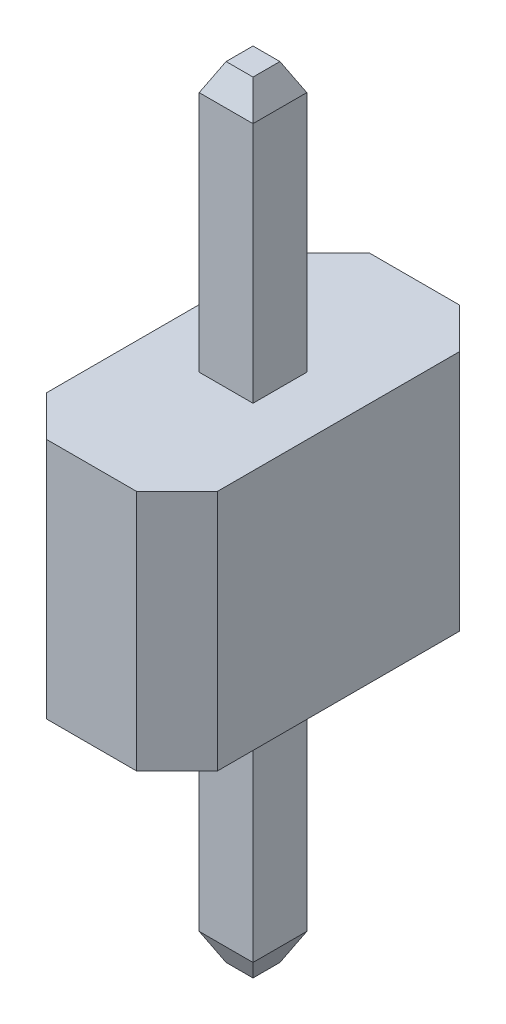
ISO-10303-21;
HEADER;
FILE_DESCRIPTION(('STEP AP214'),'2;1');
FILE_NAME('part.step','',(''),(''),'','','');
FILE_SCHEMA(('AUTOMOTIVE_DESIGN { 1 0 10303 214 1 1 1 1 }'));
ENDSEC;
DATA;
#1=APPLICATION_CONTEXT('core data for automotive mechanical design processes');
#2=APPLICATION_PROTOCOL_DEFINITION('international standard','automotive_design',2000,#1);
#3=PRODUCT_CONTEXT('',#1,'mechanical');
#4=PRODUCT('Part','Part','',(#3));
#5=PRODUCT_RELATED_PRODUCT_CATEGORY('part','',(#4));
#6=PRODUCT_DEFINITION_FORMATION('','',#4);
#7=PRODUCT_DEFINITION_CONTEXT('part definition',#1,'design');
#8=PRODUCT_DEFINITION('design','',#6,#7);
#9=PRODUCT_DEFINITION_SHAPE('','',#8);
#10=(LENGTH_UNIT() NAMED_UNIT(*) SI_UNIT(.MILLI.,.METRE.));
#11=(NAMED_UNIT(*) PLANE_ANGLE_UNIT() SI_UNIT($,.RADIAN.));
#12=(NAMED_UNIT(*) SI_UNIT($,.STERADIAN.) SOLID_ANGLE_UNIT());
#13=UNCERTAINTY_MEASURE_WITH_UNIT(LENGTH_MEASURE(1.E-05),#10,'distance_accuracy_value','');
#14=(GEOMETRIC_REPRESENTATION_CONTEXT(3) GLOBAL_UNCERTAINTY_ASSIGNED_CONTEXT((#13)) GLOBAL_UNIT_ASSIGNED_CONTEXT((#10,
#11,#12)) REPRESENTATION_CONTEXT('',''));
#15=CARTESIAN_POINT('',(0.,0.,0.));
#16=DIRECTION('',(0.,0.,1.));
#17=DIRECTION('',(1.,0.,0.));
#18=AXIS2_PLACEMENT_3D('',#15,#16,#17);
#19=CARTESIAN_POINT('',(0.635,1.8,-1.2));
#20=DIRECTION('',(-1.,0.,0.));
#21=DIRECTION('',(0.,0.,1.));
#22=AXIS2_PLACEMENT_3D('',#19,#20,#21);
#23=PLANE('',#22);
#24=DIRECTION('',(0.,0.,-1.));
#25=VECTOR('',#24,1.);
#26=CARTESIAN_POINT('',(0.635,1.8,-1.2));
#27=LINE('',#26,#25);
#28=CARTESIAN_POINT('',(0.635,1.8,0.9));
#29=VERTEX_POINT('',#28);
#30=CARTESIAN_POINT('',(0.635,1.8,-0.9));
#31=VERTEX_POINT('',#30);
#32=EDGE_CURVE('E196',#29,#31,#27,.T.);
#33=ORIENTED_EDGE('',*,*,#32,.F.);
#34=DIRECTION('',(0.,1.,0.));
#35=VECTOR('',#34,1.);
#36=CARTESIAN_POINT('',(0.635,-2.,0.9));
#37=LINE('',#36,#35);
#38=CARTESIAN_POINT('',(0.635,0.,0.9));
#39=VERTEX_POINT('',#38);
#40=EDGE_CURVE('E627',#39,#29,#37,.T.);
#41=ORIENTED_EDGE('',*,*,#40,.F.);
#42=DIRECTION('',(0.,0.,-1.));
#43=VECTOR('',#42,1.);
#44=CARTESIAN_POINT('',(0.635,0.,-1.2));
#45=LINE('',#44,#43);
#46=CARTESIAN_POINT('',(0.635,0.,-0.9));
#47=VERTEX_POINT('',#46);
#48=EDGE_CURVE('E214',#39,#47,#45,.T.);
#49=ORIENTED_EDGE('',*,*,#48,.T.);
#50=DIRECTION('',(0.,1.,0.));
#51=VECTOR('',#50,1.);
#52=CARTESIAN_POINT('',(0.635,-2.,-0.9));
#53=LINE('',#52,#51);
#54=EDGE_CURVE('E184',#47,#31,#53,.T.);
#55=ORIENTED_EDGE('',*,*,#54,.T.);
#56=EDGE_LOOP('',(#33,#41,#49,#55));
#57=FACE_BOUND('',#56,.T.);
#58=ADVANCED_FACE('F36',(#57),#23,.F.);
#59=CARTESIAN_POINT('',(-0.635,1.8,-1.2));
#60=DIRECTION('',(0.,0.,1.));
#61=DIRECTION('',(1.,0.,0.));
#62=AXIS2_PLACEMENT_3D('',#59,#60,#61);
#63=PLANE('',#62);
#64=DIRECTION('',(-1.,0.,0.));
#65=VECTOR('',#64,1.);
#66=CARTESIAN_POINT('',(-0.635,1.8,-1.2));
#67=LINE('',#66,#65);
#68=CARTESIAN_POINT('',(0.335,1.8,-1.2));
#69=VERTEX_POINT('',#68);
#70=CARTESIAN_POINT('',(-0.335,1.8,-1.2));
#71=VERTEX_POINT('',#70);
#72=EDGE_CURVE('E193',#69,#71,#67,.T.);
#73=ORIENTED_EDGE('',*,*,#72,.F.);
#74=DIRECTION('',(0.,1.,0.));
#75=VECTOR('',#74,1.);
#76=CARTESIAN_POINT('',(0.335,-2.,-1.2));
#77=LINE('',#76,#75);
#78=CARTESIAN_POINT('',(0.335,0.,-1.2));
#79=VERTEX_POINT('',#78);
#80=EDGE_CURVE('E173',#79,#69,#77,.T.);
#81=ORIENTED_EDGE('',*,*,#80,.F.);
#82=DIRECTION('',(-1.,0.,0.));
#83=VECTOR('',#82,1.);
#84=CARTESIAN_POINT('',(-0.635,0.,-1.2));
#85=LINE('',#84,#83);
#86=CARTESIAN_POINT('',(-0.335,0.,-1.2));
#87=VERTEX_POINT('',#86);
#88=EDGE_CURVE('E217',#79,#87,#85,.T.);
#89=ORIENTED_EDGE('',*,*,#88,.T.);
#90=DIRECTION('',(0.,1.,0.));
#91=VECTOR('',#90,1.);
#92=CARTESIAN_POINT('',(-0.335,-2.,-1.2));
#93=LINE('',#92,#91);
#94=EDGE_CURVE('E201',#87,#71,#93,.T.);
#95=ORIENTED_EDGE('',*,*,#94,.T.);
#96=EDGE_LOOP('',(#73,#81,#89,#95));
#97=FACE_BOUND('',#96,.T.);
#98=ADVANCED_FACE('F200',(#97),#63,.F.);
#99=CARTESIAN_POINT('',(-0.635,1.8,-1.2));
#100=DIRECTION('',(1.,0.,0.));
#101=DIRECTION('',(0.,0.,-1.));
#102=AXIS2_PLACEMENT_3D('',#99,#100,#101);
#103=PLANE('',#102);
#104=DIRECTION('',(0.,0.,1.));
#105=VECTOR('',#104,1.);
#106=CARTESIAN_POINT('',(-0.635,0.,-1.2));
#107=LINE('',#106,#105);
#108=CARTESIAN_POINT('',(-0.635,0.,-0.9));
#109=VERTEX_POINT('',#108);
#110=CARTESIAN_POINT('',(-0.635,0.,0.9));
#111=VERTEX_POINT('',#110);
#112=EDGE_CURVE('E220',#109,#111,#107,.T.);
#113=ORIENTED_EDGE('',*,*,#112,.T.);
#114=DIRECTION('',(0.,1.,0.));
#115=VECTOR('',#114,1.);
#116=CARTESIAN_POINT('',(-0.635,-2.,0.9));
#117=LINE('',#116,#115);
#118=CARTESIAN_POINT('',(-0.635,1.8,0.9));
#119=VERTEX_POINT('',#118);
#120=EDGE_CURVE('E617',#111,#119,#117,.T.);
#121=ORIENTED_EDGE('',*,*,#120,.T.);
#122=DIRECTION('',(0.,0.,1.));
#123=VECTOR('',#122,1.);
#124=CARTESIAN_POINT('',(-0.635,1.8,-1.2));
#125=LINE('',#124,#123);
#126=CARTESIAN_POINT('',(-0.635,1.8,-0.9));
#127=VERTEX_POINT('',#126);
#128=EDGE_CURVE('E202',#127,#119,#125,.T.);
#129=ORIENTED_EDGE('',*,*,#128,.F.);
#130=DIRECTION('',(0.,1.,0.));
#131=VECTOR('',#130,1.);
#132=CARTESIAN_POINT('',(-0.635,-2.,-0.9));
#133=LINE('',#132,#131);
#134=EDGE_CURVE('E355',#109,#127,#133,.T.);
#135=ORIENTED_EDGE('',*,*,#134,.F.);
#136=EDGE_LOOP('',(#113,#121,#129,#135));
#137=FACE_BOUND('',#136,.T.);
#138=ADVANCED_FACE('F387',(#137),#103,.F.);
#139=CARTESIAN_POINT('',(-0.635,1.8,1.2));
#140=DIRECTION('',(0.,0.,-1.));
#141=DIRECTION('',(-1.,0.,0.));
#142=AXIS2_PLACEMENT_3D('',#139,#140,#141);
#143=PLANE('',#142);
#144=DIRECTION('',(1.,0.,0.));
#145=VECTOR('',#144,1.);
#146=CARTESIAN_POINT('',(-0.635,1.8,1.2));
#147=LINE('',#146,#145);
#148=CARTESIAN_POINT('',(-0.335,1.8,1.2));
#149=VERTEX_POINT('',#148);
#150=CARTESIAN_POINT('',(0.335,1.8,1.2));
#151=VERTEX_POINT('',#150);
#152=EDGE_CURVE('E205',#149,#151,#147,.T.);
#153=ORIENTED_EDGE('',*,*,#152,.F.);
#154=DIRECTION('',(0.,1.,0.));
#155=VECTOR('',#154,1.);
#156=CARTESIAN_POINT('',(-0.335,-2.,1.2));
#157=LINE('',#156,#155);
#158=CARTESIAN_POINT('',(-0.335,0.,1.2));
#159=VERTEX_POINT('',#158);
#160=EDGE_CURVE('E620',#159,#149,#157,.T.);
#161=ORIENTED_EDGE('',*,*,#160,.F.);
#162=DIRECTION('',(1.,0.,0.));
#163=VECTOR('',#162,1.);
#164=CARTESIAN_POINT('',(-0.635,0.,1.2));
#165=LINE('',#164,#163);
#166=CARTESIAN_POINT('',(0.335,0.,1.2));
#167=VERTEX_POINT('',#166);
#168=EDGE_CURVE('E207',#159,#167,#165,.T.);
#169=ORIENTED_EDGE('',*,*,#168,.T.);
#170=DIRECTION('',(0.,1.,0.));
#171=VECTOR('',#170,1.);
#172=CARTESIAN_POINT('',(0.335,-2.,1.2));
#173=LINE('',#172,#171);
#174=EDGE_CURVE('E197',#167,#151,#173,.T.);
#175=ORIENTED_EDGE('',*,*,#174,.T.);
#176=EDGE_LOOP('',(#153,#161,#169,#175));
#177=FACE_BOUND('',#176,.T.);
#178=ADVANCED_FACE('F579',(#177),#143,.F.);
#179=CARTESIAN_POINT('',(0.,1.8,0.));
#180=DIRECTION('',(0.,1.,0.));
#181=DIRECTION('',(0.,0.,1.));
#182=AXIS2_PLACEMENT_3D('',#179,#180,#181);
#183=PLANE('',#182);
#184=DIRECTION('',(-0.707106781186548,0.,-0.707106781186547));
#185=VECTOR('',#184,1.);
#186=CARTESIAN_POINT('',(-0.335,1.8,1.2));
#187=LINE('',#186,#185);
#188=EDGE_CURVE('E275',#149,#119,#187,.T.);
#189=ORIENTED_EDGE('',*,*,#188,.F.);
#190=ORIENTED_EDGE('',*,*,#152,.T.);
#191=DIRECTION('',(-0.707106781186548,0.,0.707106781186547));
#192=VECTOR('',#191,1.);
#193=CARTESIAN_POINT('',(0.335,1.8,1.2));
#194=LINE('',#193,#192);
#195=EDGE_CURVE('E623',#29,#151,#194,.T.);
#196=ORIENTED_EDGE('',*,*,#195,.F.);
#197=ORIENTED_EDGE('',*,*,#32,.T.);
#198=DIRECTION('',(0.707106781186548,0.,0.707106781186547));
#199=VECTOR('',#198,1.);
#200=CARTESIAN_POINT('',(0.335,1.8,-1.2));
#201=LINE('',#200,#199);
#202=EDGE_CURVE('E176',#69,#31,#201,.T.);
#203=ORIENTED_EDGE('',*,*,#202,.F.);
#204=ORIENTED_EDGE('',*,*,#72,.T.);
#205=DIRECTION('',(0.707106781186548,0.,-0.707106781186547));
#206=VECTOR('',#205,1.);
#207=CARTESIAN_POINT('',(-0.335,1.8,-1.2));
#208=LINE('',#207,#206);
#209=EDGE_CURVE('E357',#127,#71,#208,.T.);
#210=ORIENTED_EDGE('',*,*,#209,.F.);
#211=ORIENTED_EDGE('',*,*,#128,.T.);
#212=EDGE_LOOP('',(#189,#190,#196,#197,#203,#204,#210,#211));
#213=FACE_BOUND('',#212,.T.);
#214=DIRECTION('',(0.,0.,-1.));
#215=VECTOR('',#214,1.);
#216=CARTESIAN_POINT('',(0.2,1.8,0.));
#217=LINE('',#216,#215);
#218=CARTESIAN_POINT('',(0.2,1.8,0.2));
#219=VERTEX_POINT('',#218);
#220=CARTESIAN_POINT('',(0.2,1.8,-0.2));
#221=VERTEX_POINT('',#220);
#222=EDGE_CURVE('E218',#219,#221,#217,.T.);
#223=ORIENTED_EDGE('',*,*,#222,.F.);
#224=DIRECTION('',(1.,0.,0.));
#225=VECTOR('',#224,1.);
#226=CARTESIAN_POINT('',(0.,1.8,0.2));
#227=LINE('',#226,#225);
#228=CARTESIAN_POINT('',(-0.2,1.8,0.2));
#229=VERTEX_POINT('',#228);
#230=EDGE_CURVE('E340',#229,#219,#227,.T.);
#231=ORIENTED_EDGE('',*,*,#230,.F.);
#232=DIRECTION('',(0.,0.,1.));
#233=VECTOR('',#232,1.);
#234=CARTESIAN_POINT('',(-0.2,1.8,0.));
#235=LINE('',#234,#233);
#236=CARTESIAN_POINT('',(-0.2,1.8,-0.2));
#237=VERTEX_POINT('',#236);
#238=EDGE_CURVE('E336',#237,#229,#235,.T.);
#239=ORIENTED_EDGE('',*,*,#238,.F.);
#240=DIRECTION('',(-1.,0.,0.));
#241=VECTOR('',#240,1.);
#242=CARTESIAN_POINT('',(0.,1.8,-0.2));
#243=LINE('',#242,#241);
#244=EDGE_CURVE('E333',#221,#237,#243,.T.);
#245=ORIENTED_EDGE('',*,*,#244,.F.);
#246=EDGE_LOOP('',(#223,#231,#239,#245));
#247=FACE_BOUND('',#246,.T.);
#248=ADVANCED_FACE('F190',(#213,#247),#183,.T.);
#249=CARTESIAN_POINT('',(0.,0.,0.));
#250=DIRECTION('',(0.,1.,0.));
#251=DIRECTION('',(0.,0.,1.));
#252=AXIS2_PLACEMENT_3D('',#249,#250,#251);
#253=PLANE('',#252);
#254=DIRECTION('',(1.,0.,0.));
#255=VECTOR('',#254,1.);
#256=CARTESIAN_POINT('',(0.,0.,0.2));
#257=LINE('',#256,#255);
#258=CARTESIAN_POINT('',(-0.2,0.,0.2));
#259=VERTEX_POINT('',#258);
#260=CARTESIAN_POINT('',(0.2,0.,0.2));
#261=VERTEX_POINT('',#260);
#262=EDGE_CURVE('E230',#259,#261,#257,.T.);
#263=ORIENTED_EDGE('',*,*,#262,.T.);
#264=DIRECTION('',(0.,0.,-1.));
#265=VECTOR('',#264,1.);
#266=CARTESIAN_POINT('',(0.2,0.,0.));
#267=LINE('',#266,#265);
#268=CARTESIAN_POINT('',(0.2,0.,-0.2));
#269=VERTEX_POINT('',#268);
#270=EDGE_CURVE('E233',#261,#269,#267,.T.);
#271=ORIENTED_EDGE('',*,*,#270,.T.);
#272=DIRECTION('',(-1.,0.,0.));
#273=VECTOR('',#272,1.);
#274=CARTESIAN_POINT('',(0.,0.,-0.2));
#275=LINE('',#274,#273);
#276=CARTESIAN_POINT('',(-0.2,0.,-0.2));
#277=VERTEX_POINT('',#276);
#278=EDGE_CURVE('E213',#269,#277,#275,.T.);
#279=ORIENTED_EDGE('',*,*,#278,.T.);
#280=DIRECTION('',(0.,0.,1.));
#281=VECTOR('',#280,1.);
#282=CARTESIAN_POINT('',(-0.2,0.,0.));
#283=LINE('',#282,#281);
#284=EDGE_CURVE('E227',#277,#259,#283,.T.);
#285=ORIENTED_EDGE('',*,*,#284,.T.);
#286=EDGE_LOOP('',(#263,#271,#279,#285));
#287=FACE_BOUND('',#286,.T.);
#288=ORIENTED_EDGE('',*,*,#168,.F.);
#289=DIRECTION('',(-0.707106781186548,0.,-0.707106781186547));
#290=VECTOR('',#289,1.);
#291=CARTESIAN_POINT('',(-0.7675,0.,0.7675));
#292=LINE('',#291,#290);
#293=EDGE_CURVE('E243',#159,#111,#292,.T.);
#294=ORIENTED_EDGE('',*,*,#293,.T.);
#295=ORIENTED_EDGE('',*,*,#112,.F.);
#296=DIRECTION('',(0.707106781186548,0.,-0.707106781186547));
#297=VECTOR('',#296,1.);
#298=CARTESIAN_POINT('',(-0.7675,0.,-0.7675));
#299=LINE('',#298,#297);
#300=EDGE_CURVE('E236',#109,#87,#299,.T.);
#301=ORIENTED_EDGE('',*,*,#300,.T.);
#302=ORIENTED_EDGE('',*,*,#88,.F.);
#303=DIRECTION('',(0.707106781186548,0.,0.707106781186547));
#304=VECTOR('',#303,1.);
#305=CARTESIAN_POINT('',(0.7675,0.,-0.7675));
#306=LINE('',#305,#304);
#307=EDGE_CURVE('E179',#79,#47,#306,.T.);
#308=ORIENTED_EDGE('',*,*,#307,.T.);
#309=ORIENTED_EDGE('',*,*,#48,.F.);
#310=DIRECTION('',(-0.707106781186548,0.,0.707106781186547));
#311=VECTOR('',#310,1.);
#312=CARTESIAN_POINT('',(0.7675,0.,0.767500000000001));
#313=LINE('',#312,#311);
#314=EDGE_CURVE('E240',#39,#167,#313,.T.);
#315=ORIENTED_EDGE('',*,*,#314,.T.);
#316=EDGE_LOOP('',(#288,#294,#295,#301,#302,#308,#309,#315));
#317=FACE_BOUND('',#316,.T.);
#318=ADVANCED_FACE('F367',(#287,#317),#253,.F.);
#319=CARTESIAN_POINT('',(0.,-2.,0.));
#320=DIRECTION('',(0.,1.,0.));
#321=DIRECTION('',(0.,0.,1.));
#322=AXIS2_PLACEMENT_3D('',#319,#320,#321);
#323=PLANE('',#322);
#324=DIRECTION('',(0.,0.,-1.));
#325=VECTOR('',#324,1.);
#326=CARTESIAN_POINT('',(-0.0999999999999998,-2.,-0.2));
#327=LINE('',#326,#325);
#328=CARTESIAN_POINT('',(-0.0999999999999997,-2.,0.0999999999999998));
#329=VERTEX_POINT('',#328);
#330=CARTESIAN_POINT('',(-0.0999999999999997,-2.,-0.0999999999999998));
#331=VERTEX_POINT('',#330);
#332=EDGE_CURVE('E282',#329,#331,#327,.T.);
#333=ORIENTED_EDGE('',*,*,#332,.T.);
#334=DIRECTION('',(1.,0.,0.));
#335=VECTOR('',#334,1.);
#336=CARTESIAN_POINT('',(0.2,-2.,-0.0999999999999998));
#337=LINE('',#336,#335);
#338=CARTESIAN_POINT('',(0.0999999999999998,-2.,-0.0999999999999998));
#339=VERTEX_POINT('',#338);
#340=EDGE_CURVE('E284',#331,#339,#337,.T.);
#341=ORIENTED_EDGE('',*,*,#340,.T.);
#342=DIRECTION('',(0.,0.,1.));
#343=VECTOR('',#342,1.);
#344=CARTESIAN_POINT('',(0.0999999999999999,-2.,0.2));
#345=LINE('',#344,#343);
#346=CARTESIAN_POINT('',(0.0999999999999999,-2.,0.0999999999999998));
#347=VERTEX_POINT('',#346);
#348=EDGE_CURVE('E278',#339,#347,#345,.T.);
#349=ORIENTED_EDGE('',*,*,#348,.T.);
#350=DIRECTION('',(-1.,0.,0.));
#351=VECTOR('',#350,1.);
#352=CARTESIAN_POINT('',(-0.2,-2.,0.0999999999999998));
#353=LINE('',#352,#351);
#354=EDGE_CURVE('E280',#347,#329,#353,.T.);
#355=ORIENTED_EDGE('',*,*,#354,.T.);
#356=EDGE_LOOP('',(#333,#341,#349,#355));
#357=FACE_BOUND('',#356,.T.);
#358=ADVANCED_FACE('F307',(#357),#323,.F.);
#359=CARTESIAN_POINT('',(-0.2,-2.,-0.2));
#360=DIRECTION('',(0.,0.,-1.));
#361=DIRECTION('',(-1.,0.,0.));
#362=AXIS2_PLACEMENT_3D('',#359,#360,#361);
#363=PLANE('',#362);
#364=DIRECTION('',(0.,1.,0.));
#365=VECTOR('',#364,1.);
#366=CARTESIAN_POINT('',(0.2,-2.,-0.2));
#367=LINE('',#366,#365);
#368=CARTESIAN_POINT('',(0.2,-1.8,-0.2));
#369=VERTEX_POINT('',#368);
#370=EDGE_CURVE('E320',#369,#269,#367,.T.);
#371=ORIENTED_EDGE('',*,*,#370,.F.);
#372=DIRECTION('',(-1.,0.,0.));
#373=VECTOR('',#372,1.);
#374=CARTESIAN_POINT('',(-0.2,-1.8,-0.2));
#375=LINE('',#374,#373);
#376=CARTESIAN_POINT('',(-0.2,-1.8,-0.2));
#377=VERTEX_POINT('',#376);
#378=EDGE_CURVE('E264',#369,#377,#375,.T.);
#379=ORIENTED_EDGE('',*,*,#378,.T.);
#380=DIRECTION('',(0.,1.,0.));
#381=VECTOR('',#380,1.);
#382=CARTESIAN_POINT('',(-0.2,-2.,-0.2));
#383=LINE('',#382,#381);
#384=EDGE_CURVE('E318',#377,#277,#383,.T.);
#385=ORIENTED_EDGE('',*,*,#384,.T.);
#386=ORIENTED_EDGE('',*,*,#278,.F.);
#387=EDGE_LOOP('',(#371,#379,#385,#386));
#388=FACE_BOUND('',#387,.T.);
#389=ADVANCED_FACE('F316',(#388),#363,.T.);
#390=CARTESIAN_POINT('',(-0.2,-2.,-0.2));
#391=DIRECTION('',(-1.,0.,0.));
#392=DIRECTION('',(0.,0.,1.));
#393=AXIS2_PLACEMENT_3D('',#390,#391,#392);
#394=PLANE('',#393);
#395=ORIENTED_EDGE('',*,*,#384,.F.);
#396=DIRECTION('',(0.,0.,1.));
#397=VECTOR('',#396,1.);
#398=CARTESIAN_POINT('',(-0.2,-1.8,0.2));
#399=LINE('',#398,#397);
#400=CARTESIAN_POINT('',(-0.2,-1.8,0.2));
#401=VERTEX_POINT('',#400);
#402=EDGE_CURVE('E60',#377,#401,#399,.T.);
#403=ORIENTED_EDGE('',*,*,#402,.T.);
#404=DIRECTION('',(0.,1.,0.));
#405=VECTOR('',#404,1.);
#406=CARTESIAN_POINT('',(-0.2,-2.,0.2));
#407=LINE('',#406,#405);
#408=EDGE_CURVE('E326',#401,#259,#407,.T.);
#409=ORIENTED_EDGE('',*,*,#408,.T.);
#410=ORIENTED_EDGE('',*,*,#284,.F.);
#411=EDGE_LOOP('',(#395,#403,#409,#410));
#412=FACE_BOUND('',#411,.T.);
#413=ADVANCED_FACE('F321',(#412),#394,.T.);
#414=CARTESIAN_POINT('',(-0.2,-2.,0.2));
#415=DIRECTION('',(0.,0.,1.));
#416=DIRECTION('',(1.,0.,0.));
#417=AXIS2_PLACEMENT_3D('',#414,#415,#416);
#418=PLANE('',#417);
#419=ORIENTED_EDGE('',*,*,#408,.F.);
#420=DIRECTION('',(1.,0.,0.));
#421=VECTOR('',#420,1.);
#422=CARTESIAN_POINT('',(0.2,-1.8,0.2));
#423=LINE('',#422,#421);
#424=CARTESIAN_POINT('',(0.2,-1.8,0.2));
#425=VERTEX_POINT('',#424);
#426=EDGE_CURVE('E45',#401,#425,#423,.T.);
#427=ORIENTED_EDGE('',*,*,#426,.T.);
#428=DIRECTION('',(0.,1.,0.));
#429=VECTOR('',#428,1.);
#430=CARTESIAN_POINT('',(0.2,-2.,0.2));
#431=LINE('',#430,#429);
#432=EDGE_CURVE('E337',#425,#261,#431,.T.);
#433=ORIENTED_EDGE('',*,*,#432,.T.);
#434=ORIENTED_EDGE('',*,*,#262,.F.);
#435=EDGE_LOOP('',(#419,#427,#433,#434));
#436=FACE_BOUND('',#435,.T.);
#437=ADVANCED_FACE('F365',(#436),#418,.T.);
#438=CARTESIAN_POINT('',(0.2,-2.,-0.2));
#439=DIRECTION('',(1.,0.,0.));
#440=DIRECTION('',(0.,0.,-1.));
#441=AXIS2_PLACEMENT_3D('',#438,#439,#440);
#442=PLANE('',#441);
#443=ORIENTED_EDGE('',*,*,#432,.F.);
#444=DIRECTION('',(0.,0.,-1.));
#445=VECTOR('',#444,1.);
#446=CARTESIAN_POINT('',(0.2,-1.8,-0.2));
#447=LINE('',#446,#445);
#448=EDGE_CURVE('E11',#425,#369,#447,.T.);
#449=ORIENTED_EDGE('',*,*,#448,.T.);
#450=ORIENTED_EDGE('',*,*,#370,.T.);
#451=ORIENTED_EDGE('',*,*,#270,.F.);
#452=EDGE_LOOP('',(#443,#449,#450,#451));
#453=FACE_BOUND('',#452,.T.);
#454=ADVANCED_FACE('F370',(#453),#442,.T.);
#455=CARTESIAN_POINT('',(0.2,3.6,-0.2));
#456=VERTEX_POINT('',#455);
#457=EDGE_CURVE('E332',#221,#456,#367,.T.);
#458=ORIENTED_EDGE('',*,*,#457,.T.);
#459=DIRECTION('',(0.,0.,1.));
#460=VECTOR('',#459,1.);
#461=CARTESIAN_POINT('',(0.2,3.6,-0.2));
#462=LINE('',#461,#460);
#463=CARTESIAN_POINT('',(0.2,3.6,0.2));
#464=VERTEX_POINT('',#463);
#465=EDGE_CURVE('E262',#456,#464,#462,.T.);
#466=ORIENTED_EDGE('',*,*,#465,.T.);
#467=EDGE_CURVE('E350',#219,#464,#431,.T.);
#468=ORIENTED_EDGE('',*,*,#467,.F.);
#469=ORIENTED_EDGE('',*,*,#222,.T.);
#470=EDGE_LOOP('',(#458,#466,#468,#469));
#471=FACE_BOUND('',#470,.T.);
#472=ADVANCED_FACE('F347',(#471),#442,.T.);
#473=ORIENTED_EDGE('',*,*,#467,.T.);
#474=DIRECTION('',(-1.,0.,0.));
#475=VECTOR('',#474,1.);
#476=CARTESIAN_POINT('',(-0.2,3.6,0.2));
#477=LINE('',#476,#475);
#478=CARTESIAN_POINT('',(-0.2,3.6,0.2));
#479=VERTEX_POINT('',#478);
#480=EDGE_CURVE('E255',#464,#479,#477,.T.);
#481=ORIENTED_EDGE('',*,*,#480,.T.);
#482=EDGE_CURVE('E322',#229,#479,#407,.T.);
#483=ORIENTED_EDGE('',*,*,#482,.F.);
#484=ORIENTED_EDGE('',*,*,#230,.T.);
#485=EDGE_LOOP('',(#473,#481,#483,#484));
#486=FACE_BOUND('',#485,.T.);
#487=ADVANCED_FACE('F377',(#486),#418,.T.);
#488=ORIENTED_EDGE('',*,*,#482,.T.);
#489=DIRECTION('',(0.,0.,-1.));
#490=VECTOR('',#489,1.);
#491=CARTESIAN_POINT('',(-0.2,3.6,-0.2));
#492=LINE('',#491,#490);
#493=CARTESIAN_POINT('',(-0.2,3.6,-0.2));
#494=VERTEX_POINT('',#493);
#495=EDGE_CURVE('E258',#479,#494,#492,.T.);
#496=ORIENTED_EDGE('',*,*,#495,.T.);
#497=EDGE_CURVE('E323',#237,#494,#383,.T.);
#498=ORIENTED_EDGE('',*,*,#497,.F.);
#499=ORIENTED_EDGE('',*,*,#238,.T.);
#500=EDGE_LOOP('',(#488,#496,#498,#499));
#501=FACE_BOUND('',#500,.T.);
#502=ADVANCED_FACE('F479',(#501),#394,.T.);
#503=ORIENTED_EDGE('',*,*,#497,.T.);
#504=DIRECTION('',(1.,0.,0.));
#505=VECTOR('',#504,1.);
#506=CARTESIAN_POINT('',(-0.2,3.6,-0.2));
#507=LINE('',#506,#505);
#508=EDGE_CURVE('E260',#494,#456,#507,.T.);
#509=ORIENTED_EDGE('',*,*,#508,.T.);
#510=ORIENTED_EDGE('',*,*,#457,.F.);
#511=ORIENTED_EDGE('',*,*,#244,.T.);
#512=EDGE_LOOP('',(#503,#509,#510,#511));
#513=FACE_BOUND('',#512,.T.);
#514=ADVANCED_FACE('F352',(#513),#363,.T.);
#515=CARTESIAN_POINT('',(0.,3.8,0.));
#516=DIRECTION('',(0.,1.,0.));
#517=DIRECTION('',(0.,0.,1.));
#518=AXIS2_PLACEMENT_3D('',#515,#516,#517);
#519=PLANE('',#518);
#520=DIRECTION('',(0.,0.,1.));
#521=VECTOR('',#520,1.);
#522=CARTESIAN_POINT('',(-0.0999999999999997,3.8,0.));
#523=LINE('',#522,#521);
#524=CARTESIAN_POINT('',(-0.0999999999999997,3.8,-0.0999999999999998));
#525=VERTEX_POINT('',#524);
#526=CARTESIAN_POINT('',(-0.0999999999999997,3.8,0.0999999999999998));
#527=VERTEX_POINT('',#526);
#528=EDGE_CURVE('E250',#525,#527,#523,.T.);
#529=ORIENTED_EDGE('',*,*,#528,.T.);
#530=DIRECTION('',(1.,0.,0.));
#531=VECTOR('',#530,1.);
#532=CARTESIAN_POINT('',(0.,3.8,0.0999999999999998));
#533=LINE('',#532,#531);
#534=CARTESIAN_POINT('',(0.0999999999999999,3.8,0.0999999999999998));
#535=VERTEX_POINT('',#534);
#536=EDGE_CURVE('E252',#527,#535,#533,.T.);
#537=ORIENTED_EDGE('',*,*,#536,.T.);
#538=DIRECTION('',(0.,0.,-1.));
#539=VECTOR('',#538,1.);
#540=CARTESIAN_POINT('',(0.0999999999999998,3.8,0.));
#541=LINE('',#540,#539);
#542=CARTESIAN_POINT('',(0.0999999999999998,3.8,-0.0999999999999998));
#543=VERTEX_POINT('',#542);
#544=EDGE_CURVE('E246',#535,#543,#541,.T.);
#545=ORIENTED_EDGE('',*,*,#544,.T.);
#546=DIRECTION('',(-1.,0.,0.));
#547=VECTOR('',#546,1.);
#548=CARTESIAN_POINT('',(0.,3.8,-0.0999999999999998));
#549=LINE('',#548,#547);
#550=EDGE_CURVE('E248',#543,#525,#549,.T.);
#551=ORIENTED_EDGE('',*,*,#550,.T.);
#552=EDGE_LOOP('',(#529,#537,#545,#551));
#553=FACE_BOUND('',#552,.T.);
#554=ADVANCED_FACE('F464',(#553),#519,.T.);
#555=CARTESIAN_POINT('',(-0.335,-2.,-1.2));
#556=DIRECTION('',(0.707106781186547,0.,0.707106781186547));
#557=DIRECTION('',(0.707106781186548,0.,-0.707106781186547));
#558=AXIS2_PLACEMENT_3D('',#555,#556,#557);
#559=PLANE('',#558);
#560=ORIENTED_EDGE('',*,*,#134,.T.);
#561=ORIENTED_EDGE('',*,*,#209,.T.);
#562=ORIENTED_EDGE('',*,*,#94,.F.);
#563=ORIENTED_EDGE('',*,*,#300,.F.);
#564=EDGE_LOOP('',(#560,#561,#562,#563));
#565=FACE_BOUND('',#564,.T.);
#566=ADVANCED_FACE('F457',(#565),#559,.F.);
#567=CARTESIAN_POINT('',(0.335,-2.,-1.2));
#568=DIRECTION('',(-0.707106781186547,0.,0.707106781186548));
#569=DIRECTION('',(0.707106781186548,0.,0.707106781186547));
#570=AXIS2_PLACEMENT_3D('',#567,#568,#569);
#571=PLANE('',#570);
#572=ORIENTED_EDGE('',*,*,#80,.T.);
#573=ORIENTED_EDGE('',*,*,#202,.T.);
#574=ORIENTED_EDGE('',*,*,#54,.F.);
#575=ORIENTED_EDGE('',*,*,#307,.F.);
#576=EDGE_LOOP('',(#572,#573,#574,#575));
#577=FACE_BOUND('',#576,.T.);
#578=ADVANCED_FACE('F175',(#577),#571,.F.);
#579=CARTESIAN_POINT('',(0.335,-2.,1.2));
#580=DIRECTION('',(-0.707106781186547,0.,-0.707106781186548));
#581=DIRECTION('',(-0.707106781186548,0.,0.707106781186547));
#582=AXIS2_PLACEMENT_3D('',#579,#580,#581);
#583=PLANE('',#582);
#584=ORIENTED_EDGE('',*,*,#40,.T.);
#585=ORIENTED_EDGE('',*,*,#195,.T.);
#586=ORIENTED_EDGE('',*,*,#174,.F.);
#587=ORIENTED_EDGE('',*,*,#314,.F.);
#588=EDGE_LOOP('',(#584,#585,#586,#587));
#589=FACE_BOUND('',#588,.T.);
#590=ADVANCED_FACE('F441',(#589),#583,.F.);
#591=CARTESIAN_POINT('',(-0.335,-2.,1.2));
#592=DIRECTION('',(0.707106781186547,0.,-0.707106781186547));
#593=DIRECTION('',(-0.707106781186548,0.,-0.707106781186547));
#594=AXIS2_PLACEMENT_3D('',#591,#592,#593);
#595=PLANE('',#594);
#596=ORIENTED_EDGE('',*,*,#160,.T.);
#597=ORIENTED_EDGE('',*,*,#188,.T.);
#598=ORIENTED_EDGE('',*,*,#120,.F.);
#599=ORIENTED_EDGE('',*,*,#293,.F.);
#600=EDGE_LOOP('',(#596,#597,#598,#599));
#601=FACE_BOUND('',#600,.T.);
#602=ADVANCED_FACE('F406',(#601),#595,.F.);
#603=CARTESIAN_POINT('',(0.,3.8,-0.0999999999999998));
#604=DIRECTION('',(0.,-0.447213595499954,0.894427190999918));
#605=DIRECTION('',(-1.,0.,0.));
#606=AXIS2_PLACEMENT_3D('',#603,#604,#605);
#607=PLANE('',#606);
#608=DIRECTION('',(-0.40824829046386,0.816496580927729,0.40824829046386));
#609=VECTOR('',#608,1.);
#610=CARTESIAN_POINT('',(0.0833333333333335,3.83333333333333,-0.0833333333333334));
#611=LINE('',#610,#609);
#612=EDGE_CURVE('E269',#456,#543,#611,.T.);
#613=ORIENTED_EDGE('',*,*,#612,.F.);
#614=ORIENTED_EDGE('',*,*,#508,.F.);
#615=DIRECTION('',(0.40824829046386,0.816496580927729,0.40824829046386));
#616=VECTOR('',#615,1.);
#617=CARTESIAN_POINT('',(-0.0833333333333334,3.83333333333333,-0.0833333333333334));
#618=LINE('',#617,#616);
#619=EDGE_CURVE('E272',#525,#494,#618,.F.);
#620=ORIENTED_EDGE('',*,*,#619,.F.);
#621=ORIENTED_EDGE('',*,*,#550,.F.);
#622=EDGE_LOOP('',(#613,#614,#620,#621));
#623=FACE_BOUND('',#622,.T.);
#624=ADVANCED_FACE('F402',(#623),#607,.F.);
#625=CARTESIAN_POINT('',(-0.0999999999999997,3.8,0.));
#626=DIRECTION('',(0.894427190999918,-0.447213595499954,0.));
#627=DIRECTION('',(0.,0.,1.));
#628=AXIS2_PLACEMENT_3D('',#625,#626,#627);
#629=PLANE('',#628);
#630=ORIENTED_EDGE('',*,*,#619,.T.);
#631=ORIENTED_EDGE('',*,*,#495,.F.);
#632=DIRECTION('',(0.40824829046386,0.816496580927729,-0.40824829046386));
#633=VECTOR('',#632,1.);
#634=CARTESIAN_POINT('',(-0.0833333333333333,3.83333333333333,0.0833333333333334));
#635=LINE('',#634,#633);
#636=EDGE_CURVE('E267',#527,#479,#635,.F.);
#637=ORIENTED_EDGE('',*,*,#636,.F.);
#638=ORIENTED_EDGE('',*,*,#528,.F.);
#639=EDGE_LOOP('',(#630,#631,#637,#638));
#640=FACE_BOUND('',#639,.T.);
#641=ADVANCED_FACE('F398',(#640),#629,.F.);
#642=CARTESIAN_POINT('',(0.0999999999999998,3.8,0.));
#643=DIRECTION('',(-0.894427190999918,-0.447213595499954,0.));
#644=DIRECTION('',(0.,0.,-1.));
#645=AXIS2_PLACEMENT_3D('',#642,#643,#644);
#646=PLANE('',#645);
#647=ORIENTED_EDGE('',*,*,#612,.T.);
#648=ORIENTED_EDGE('',*,*,#544,.F.);
#649=DIRECTION('',(0.40824829046386,-0.816496580927729,0.40824829046386));
#650=VECTOR('',#649,1.);
#651=CARTESIAN_POINT('',(0.0833333333333335,3.83333333333333,0.0833333333333334));
#652=LINE('',#651,#650);
#653=EDGE_CURVE('E265',#464,#535,#652,.F.);
#654=ORIENTED_EDGE('',*,*,#653,.F.);
#655=ORIENTED_EDGE('',*,*,#465,.F.);
#656=EDGE_LOOP('',(#647,#648,#654,#655));
#657=FACE_BOUND('',#656,.T.);
#658=ADVANCED_FACE('F394',(#657),#646,.F.);
#659=CARTESIAN_POINT('',(0.,3.8,0.0999999999999998));
#660=DIRECTION('',(0.,-0.447213595499954,-0.894427190999918));
#661=DIRECTION('',(1.,0.,0.));
#662=AXIS2_PLACEMENT_3D('',#659,#660,#661);
#663=PLANE('',#662);
#664=ORIENTED_EDGE('',*,*,#636,.T.);
#665=ORIENTED_EDGE('',*,*,#480,.F.);
#666=ORIENTED_EDGE('',*,*,#653,.T.);
#667=ORIENTED_EDGE('',*,*,#536,.F.);
#668=EDGE_LOOP('',(#664,#665,#666,#667));
#669=FACE_BOUND('',#668,.T.);
#670=ADVANCED_FACE('F391',(#669),#663,.F.);
#671=CARTESIAN_POINT('',(-0.2,-1.8,0.2));
#672=DIRECTION('',(0.,-0.447213595499956,0.894427190999917));
#673=DIRECTION('',(-1.,0.,0.));
#674=AXIS2_PLACEMENT_3D('',#671,#672,#673);
#675=PLANE('',#674);
#676=DIRECTION('',(0.408248290463862,-0.816496580927727,-0.408248290463862));
#677=VECTOR('',#676,1.);
#678=CARTESIAN_POINT('',(-0.2,-1.8,0.2));
#679=LINE('',#678,#677);
#680=EDGE_CURVE('E292',#329,#401,#679,.F.);
#681=ORIENTED_EDGE('',*,*,#680,.F.);
#682=ORIENTED_EDGE('',*,*,#354,.F.);
#683=DIRECTION('',(-0.408248290463862,-0.816496580927727,-0.408248290463862));
#684=VECTOR('',#683,1.);
#685=CARTESIAN_POINT('',(0.133333333333334,-1.93333333333333,0.133333333333334));
#686=LINE('',#685,#684);
#687=EDGE_CURVE('E40',#425,#347,#686,.T.);
#688=ORIENTED_EDGE('',*,*,#687,.F.);
#689=ORIENTED_EDGE('',*,*,#426,.F.);
#690=EDGE_LOOP('',(#681,#682,#688,#689));
#691=FACE_BOUND('',#690,.T.);
#692=ADVANCED_FACE('F38',(#691),#675,.T.);
#693=CARTESIAN_POINT('',(0.2,-1.8,-0.2));
#694=DIRECTION('',(0.894427190999917,-0.447213595499956,0.));
#695=DIRECTION('',(0.,0.,1.));
#696=AXIS2_PLACEMENT_3D('',#693,#694,#695);
#697=PLANE('',#696);
#698=ORIENTED_EDGE('',*,*,#687,.T.);
#699=ORIENTED_EDGE('',*,*,#348,.F.);
#700=DIRECTION('',(0.408248290463862,0.816496580927727,-0.408248290463862));
#701=VECTOR('',#700,1.);
#702=CARTESIAN_POINT('',(0.2,-1.8,-0.2));
#703=LINE('',#702,#701);
#704=EDGE_CURVE('E291',#369,#339,#703,.F.);
#705=ORIENTED_EDGE('',*,*,#704,.F.);
#706=ORIENTED_EDGE('',*,*,#448,.F.);
#707=EDGE_LOOP('',(#698,#699,#705,#706));
#708=FACE_BOUND('',#707,.T.);
#709=ADVANCED_FACE('F302',(#708),#697,.T.);
#710=CARTESIAN_POINT('',(-0.2,-1.8,-0.2));
#711=DIRECTION('',(-0.894427190999917,-0.447213595499956,0.));
#712=DIRECTION('',(0.,0.,-1.));
#713=AXIS2_PLACEMENT_3D('',#710,#711,#712);
#714=PLANE('',#713);
#715=ORIENTED_EDGE('',*,*,#680,.T.);
#716=ORIENTED_EDGE('',*,*,#402,.F.);
#717=DIRECTION('',(0.408248290463862,-0.816496580927727,0.408248290463862));
#718=VECTOR('',#717,1.);
#719=CARTESIAN_POINT('',(-0.2,-1.8,-0.2));
#720=LINE('',#719,#718);
#721=EDGE_CURVE('E289',#331,#377,#720,.F.);
#722=ORIENTED_EDGE('',*,*,#721,.F.);
#723=ORIENTED_EDGE('',*,*,#332,.F.);
#724=EDGE_LOOP('',(#715,#716,#722,#723));
#725=FACE_BOUND('',#724,.T.);
#726=ADVANCED_FACE('F313',(#725),#714,.T.);
#727=CARTESIAN_POINT('',(-0.2,-1.8,-0.2));
#728=DIRECTION('',(0.,-0.447213595499956,-0.894427190999917));
#729=DIRECTION('',(1.,0.,0.));
#730=AXIS2_PLACEMENT_3D('',#727,#728,#729);
#731=PLANE('',#730);
#732=ORIENTED_EDGE('',*,*,#704,.T.);
#733=ORIENTED_EDGE('',*,*,#340,.F.);
#734=ORIENTED_EDGE('',*,*,#721,.T.);
#735=ORIENTED_EDGE('',*,*,#378,.F.);
#736=EDGE_LOOP('',(#732,#733,#734,#735));
#737=FACE_BOUND('',#736,.T.);
#738=ADVANCED_FACE('F311',(#737),#731,.T.);
#739=CLOSED_SHELL('',(#58,#98,#138,#178,#248,#318,#358,#389,#413,#437,#454,#472,#487,#502,#514,
#554,#566,#578,#590,#602,#624,#641,#658,#670,#692,#709,#726,#738));
#740=MANIFOLD_SOLID_BREP('B2',#739);
#741=ADVANCED_BREP_SHAPE_REPRESENTATION('',(#18,#740),#14);
#742=SHAPE_DEFINITION_REPRESENTATION(#9,#741);
ENDSEC;
END-ISO-10303-21;
